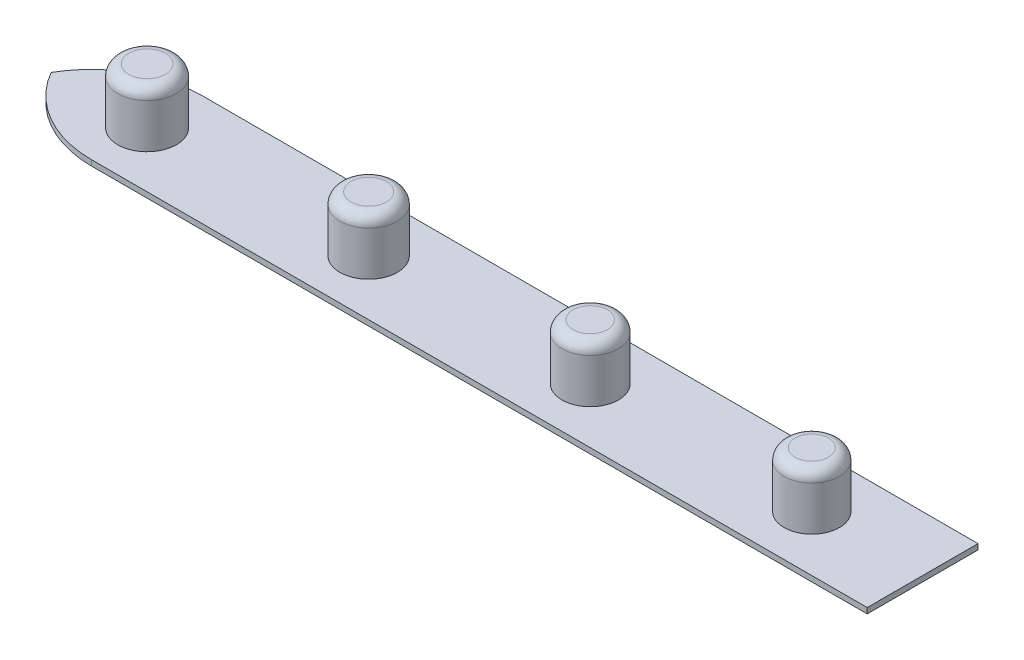
ISO-10303-21;
HEADER;
FILE_DESCRIPTION(('STEP AP214'),'2;1');
FILE_NAME('part.step','',(''),(''),'','','');
FILE_SCHEMA(('AUTOMOTIVE_DESIGN { 1 0 10303 214 1 1 1 1 }'));
ENDSEC;
DATA;
#1=APPLICATION_CONTEXT('core data for automotive mechanical design processes');
#2=APPLICATION_PROTOCOL_DEFINITION('international standard','automotive_design',2000,#1);
#3=PRODUCT_CONTEXT('',#1,'mechanical');
#4=PRODUCT('Part','Part','',(#3));
#5=PRODUCT_RELATED_PRODUCT_CATEGORY('part','',(#4));
#6=PRODUCT_DEFINITION_FORMATION('','',#4);
#7=PRODUCT_DEFINITION_CONTEXT('part definition',#1,'design');
#8=PRODUCT_DEFINITION('design','',#6,#7);
#9=PRODUCT_DEFINITION_SHAPE('','',#8);
#10=(LENGTH_UNIT() NAMED_UNIT(*) SI_UNIT(.MILLI.,.METRE.));
#11=(NAMED_UNIT(*) PLANE_ANGLE_UNIT() SI_UNIT($,.RADIAN.));
#12=(NAMED_UNIT(*) SI_UNIT($,.STERADIAN.) SOLID_ANGLE_UNIT());
#13=UNCERTAINTY_MEASURE_WITH_UNIT(LENGTH_MEASURE(1.E-05),#10,'distance_accuracy_value','');
#14=(GEOMETRIC_REPRESENTATION_CONTEXT(3) GLOBAL_UNCERTAINTY_ASSIGNED_CONTEXT((#13)) GLOBAL_UNIT_ASSIGNED_CONTEXT((#10,
#11,#12)) REPRESENTATION_CONTEXT('',''));
#15=CARTESIAN_POINT('',(0.,0.,0.));
#16=DIRECTION('',(0.,0.,1.));
#17=DIRECTION('',(1.,0.,0.));
#18=AXIS2_PLACEMENT_3D('',#15,#16,#17);
#19=CARTESIAN_POINT('',(40.,0.5,-5.));
#20=DIRECTION('',(-1.,0.,0.));
#21=DIRECTION('',(0.,0.,1.));
#22=AXIS2_PLACEMENT_3D('',#19,#20,#21);
#23=PLANE('',#22);
#24=DIRECTION('',(0.,0.,-1.));
#25=VECTOR('',#24,1.);
#26=CARTESIAN_POINT('',(40.,0.,-5.));
#27=LINE('',#26,#25);
#28=CARTESIAN_POINT('',(40.,0.,5.));
#29=VERTEX_POINT('',#28);
#30=CARTESIAN_POINT('',(40.,0.,-5.));
#31=VERTEX_POINT('',#30);
#32=EDGE_CURVE('E96',#29,#31,#27,.T.);
#33=ORIENTED_EDGE('',*,*,#32,.T.);
#34=DIRECTION('',(0.,-1.,0.));
#35=VECTOR('',#34,1.);
#36=CARTESIAN_POINT('',(40.,0.5,-5.));
#37=LINE('',#36,#35);
#38=CARTESIAN_POINT('',(40.,0.5,-5.));
#39=VERTEX_POINT('',#38);
#40=EDGE_CURVE('E81',#39,#31,#37,.T.);
#41=ORIENTED_EDGE('',*,*,#40,.F.);
#42=DIRECTION('',(0.,0.,-1.));
#43=VECTOR('',#42,1.);
#44=CARTESIAN_POINT('',(40.,0.5,-5.));
#45=LINE('',#44,#43);
#46=CARTESIAN_POINT('',(40.,0.5,5.));
#47=VERTEX_POINT('',#46);
#48=EDGE_CURVE('E86',#47,#39,#45,.T.);
#49=ORIENTED_EDGE('',*,*,#48,.F.);
#50=DIRECTION('',(0.,-1.,0.));
#51=VECTOR('',#50,1.);
#52=CARTESIAN_POINT('',(40.,0.5,5.));
#53=LINE('',#52,#51);
#54=EDGE_CURVE('E98',#47,#29,#53,.T.);
#55=ORIENTED_EDGE('',*,*,#54,.T.);
#56=EDGE_LOOP('',(#33,#41,#49,#55));
#57=FACE_BOUND('',#56,.T.);
#58=ADVANCED_FACE('F32',(#57),#23,.F.);
#59=CARTESIAN_POINT('',(-40.,0.5,-5.));
#60=DIRECTION('',(0.,0.,1.));
#61=DIRECTION('',(1.,0.,0.));
#62=AXIS2_PLACEMENT_3D('',#59,#60,#61);
#63=PLANE('',#62);
#64=DIRECTION('',(-1.,0.,0.));
#65=VECTOR('',#64,1.);
#66=CARTESIAN_POINT('',(-40.,0.,-5.));
#67=LINE('',#66,#65);
#68=CARTESIAN_POINT('',(-29.9999999999999,0.,-5.));
#69=VERTEX_POINT('',#68);
#70=EDGE_CURVE('E135',#31,#69,#67,.T.);
#71=ORIENTED_EDGE('',*,*,#70,.T.);
#72=DIRECTION('',(0.,-1.,0.));
#73=VECTOR('',#72,1.);
#74=CARTESIAN_POINT('',(-29.9999999999999,0.5,-5.));
#75=LINE('',#74,#73);
#76=CARTESIAN_POINT('',(-29.9999999999999,0.5,-5.));
#77=VERTEX_POINT('',#76);
#78=EDGE_CURVE('E84',#69,#77,#75,.F.);
#79=ORIENTED_EDGE('',*,*,#78,.T.);
#80=DIRECTION('',(-1.,0.,0.));
#81=VECTOR('',#80,1.);
#82=CARTESIAN_POINT('',(-40.,0.5,-5.));
#83=LINE('',#82,#81);
#84=EDGE_CURVE('E76',#39,#77,#83,.T.);
#85=ORIENTED_EDGE('',*,*,#84,.F.);
#86=ORIENTED_EDGE('',*,*,#40,.T.);
#87=EDGE_LOOP('',(#71,#79,#85,#86));
#88=FACE_BOUND('',#87,.T.);
#89=ADVANCED_FACE('F79',(#88),#63,.F.);
#90=CARTESIAN_POINT('',(-39.9999999999999,0.5,5.));
#91=DIRECTION('',(0.,0.,-1.));
#92=DIRECTION('',(-1.,0.,0.));
#93=AXIS2_PLACEMENT_3D('',#90,#91,#92);
#94=PLANE('',#93);
#95=DIRECTION('',(1.,0.,0.));
#96=VECTOR('',#95,1.);
#97=CARTESIAN_POINT('',(-39.9999999999999,0.5,5.));
#98=LINE('',#97,#96);
#99=CARTESIAN_POINT('',(-30.,0.5,5.));
#100=VERTEX_POINT('',#99);
#101=EDGE_CURVE('E85',#100,#47,#98,.T.);
#102=ORIENTED_EDGE('',*,*,#101,.F.);
#103=DIRECTION('',(0.,-1.,0.));
#104=VECTOR('',#103,1.);
#105=CARTESIAN_POINT('',(-30.,0.5,5.));
#106=LINE('',#105,#104);
#107=CARTESIAN_POINT('',(-30.,0.,5.));
#108=VERTEX_POINT('',#107);
#109=EDGE_CURVE('E11',#100,#108,#106,.T.);
#110=ORIENTED_EDGE('',*,*,#109,.T.);
#111=DIRECTION('',(1.,0.,0.));
#112=VECTOR('',#111,1.);
#113=CARTESIAN_POINT('',(-39.9999999999999,0.,5.));
#114=LINE('',#113,#112);
#115=EDGE_CURVE('E93',#108,#29,#114,.T.);
#116=ORIENTED_EDGE('',*,*,#115,.T.);
#117=ORIENTED_EDGE('',*,*,#54,.F.);
#118=EDGE_LOOP('',(#102,#110,#116,#117));
#119=FACE_BOUND('',#118,.T.);
#120=ADVANCED_FACE('F161',(#119),#94,.F.);
#121=CARTESIAN_POINT('',(0.,0.5,0.));
#122=DIRECTION('',(0.,1.,0.));
#123=DIRECTION('',(0.,0.,1.));
#124=AXIS2_PLACEMENT_3D('',#121,#122,#123);
#125=PLANE('',#124);
#126=CARTESIAN_POINT('',(30.0000000000001,0.5,0.));
#127=DIRECTION('',(0.,1.,0.));
#128=DIRECTION('',(0.,0.,1.));
#129=AXIS2_PLACEMENT_3D('',#126,#127,#128);
#130=CIRCLE('',#129,2.5);
#131=CARTESIAN_POINT('',(30.0000000000001,0.5,2.5));
#132=VERTEX_POINT('',#131);
#133=EDGE_CURVE('E144',#132,#132,#130,.T.);
#134=ORIENTED_EDGE('',*,*,#133,.F.);
#135=EDGE_LOOP('',(#134));
#136=FACE_BOUND('',#135,.T.);
#137=CARTESIAN_POINT('',(10.0000000000001,0.5,0.));
#138=DIRECTION('',(0.,1.,0.));
#139=DIRECTION('',(0.,0.,1.));
#140=AXIS2_PLACEMENT_3D('',#137,#138,#139);
#141=CIRCLE('',#140,2.55);
#142=CARTESIAN_POINT('',(10.0000000000001,0.5,2.55));
#143=VERTEX_POINT('',#142);
#144=EDGE_CURVE('E146',#143,#143,#141,.T.);
#145=ORIENTED_EDGE('',*,*,#144,.F.);
#146=EDGE_LOOP('',(#145));
#147=FACE_BOUND('',#146,.T.);
#148=CARTESIAN_POINT('',(-9.99999999999994,0.5,0.));
#149=DIRECTION('',(0.,1.,0.));
#150=DIRECTION('',(0.,0.,1.));
#151=AXIS2_PLACEMENT_3D('',#148,#149,#150);
#152=CIRCLE('',#151,2.6);
#153=CARTESIAN_POINT('',(-9.99999999999994,0.5,2.6));
#154=VERTEX_POINT('',#153);
#155=EDGE_CURVE('E151',#154,#154,#152,.T.);
#156=ORIENTED_EDGE('',*,*,#155,.F.);
#157=EDGE_LOOP('',(#156));
#158=FACE_BOUND('',#157,.T.);
#159=CARTESIAN_POINT('',(-29.9999999999999,0.5,0.));
#160=DIRECTION('',(0.,1.,0.));
#161=DIRECTION('',(0.,0.,1.));
#162=AXIS2_PLACEMENT_3D('',#159,#160,#161);
#163=CIRCLE('',#162,2.65);
#164=CARTESIAN_POINT('',(-29.9999999999999,0.5,2.65));
#165=VERTEX_POINT('',#164);
#166=EDGE_CURVE('E156',#165,#165,#163,.T.);
#167=ORIENTED_EDGE('',*,*,#166,.F.);
#168=EDGE_LOOP('',(#167));
#169=FACE_BOUND('',#168,.T.);
#170=ORIENTED_EDGE('',*,*,#84,.T.);
#171=CARTESIAN_POINT('',(-29.9999999999999,0.5,5.));
#172=DIRECTION('',(0.,1.,0.));
#173=DIRECTION('',(0.,0.,1.));
#174=AXIS2_PLACEMENT_3D('',#171,#172,#173);
#175=CIRCLE('',#174,10.);
#176=CARTESIAN_POINT('',(-38.6602540378443,0.5,0.));
#177=VERTEX_POINT('',#176);
#178=EDGE_CURVE('E41',#77,#177,#175,.T.);
#179=ORIENTED_EDGE('',*,*,#178,.T.);
#180=CARTESIAN_POINT('',(-30.,0.5,-5.));
#181=DIRECTION('',(0.,1.,0.));
#182=DIRECTION('',(0.,0.,1.));
#183=AXIS2_PLACEMENT_3D('',#180,#181,#182);
#184=CIRCLE('',#183,10.);
#185=EDGE_CURVE('E51',#177,#100,#184,.T.);
#186=ORIENTED_EDGE('',*,*,#185,.T.);
#187=ORIENTED_EDGE('',*,*,#101,.T.);
#188=ORIENTED_EDGE('',*,*,#48,.T.);
#189=EDGE_LOOP('',(#170,#179,#186,#187,#188));
#190=FACE_BOUND('',#189,.T.);
#191=ADVANCED_FACE('F89',(#136,#147,#158,#169,#190),#125,.T.);
#192=CARTESIAN_POINT('',(0.,0.,0.));
#193=DIRECTION('',(0.,1.,0.));
#194=DIRECTION('',(0.,0.,1.));
#195=AXIS2_PLACEMENT_3D('',#192,#193,#194);
#196=PLANE('',#195);
#197=CARTESIAN_POINT('',(-30.,0.,-5.));
#198=DIRECTION('',(0.,1.,0.));
#199=DIRECTION('',(0.,0.,1.));
#200=AXIS2_PLACEMENT_3D('',#197,#198,#199);
#201=CIRCLE('',#200,10.);
#202=CARTESIAN_POINT('',(-38.6602540378443,0.,0.));
#203=VERTEX_POINT('',#202);
#204=EDGE_CURVE('E126',#108,#203,#201,.F.);
#205=ORIENTED_EDGE('',*,*,#204,.T.);
#206=CARTESIAN_POINT('',(-29.9999999999999,0.,5.));
#207=DIRECTION('',(0.,1.,0.));
#208=DIRECTION('',(0.,0.,1.));
#209=AXIS2_PLACEMENT_3D('',#206,#207,#208);
#210=CIRCLE('',#209,10.);
#211=EDGE_CURVE('E128',#203,#69,#210,.F.);
#212=ORIENTED_EDGE('',*,*,#211,.T.);
#213=ORIENTED_EDGE('',*,*,#70,.F.);
#214=ORIENTED_EDGE('',*,*,#32,.F.);
#215=ORIENTED_EDGE('',*,*,#115,.F.);
#216=EDGE_LOOP('',(#205,#212,#213,#214,#215));
#217=FACE_BOUND('',#216,.T.);
#218=ADVANCED_FACE('F134',(#217),#196,.F.);
#219=CARTESIAN_POINT('',(-29.9999999999999,5.5,0.));
#220=DIRECTION('',(0.,-1.,0.));
#221=DIRECTION('',(0.,0.,-1.));
#222=AXIS2_PLACEMENT_3D('',#219,#220,#221);
#223=CYLINDRICAL_SURFACE('',#222,2.65);
#224=CARTESIAN_POINT('',(-29.9999999999999,4.5,0.));
#225=DIRECTION('',(0.,1.,0.));
#226=DIRECTION('',(0.,0.,1.));
#227=AXIS2_PLACEMENT_3D('',#224,#225,#226);
#228=CIRCLE('',#227,2.65);
#229=CARTESIAN_POINT('',(-29.9999999999999,4.5,2.65));
#230=VERTEX_POINT('',#229);
#231=EDGE_CURVE('E123',#230,#230,#228,.F.);
#232=ORIENTED_EDGE('',*,*,#231,.T.);
#233=EDGE_LOOP('',(#232));
#234=FACE_BOUND('',#233,.T.);
#235=ORIENTED_EDGE('',*,*,#166,.T.);
#236=EDGE_LOOP('',(#235));
#237=FACE_BOUND('',#236,.T.);
#238=ADVANCED_FACE('F216',(#234,#237),#223,.T.);
#239=CARTESIAN_POINT('',(-29.9999999999999,5.5,0.));
#240=DIRECTION('',(0.,1.,0.));
#241=DIRECTION('',(0.,0.,1.));
#242=AXIS2_PLACEMENT_3D('',#239,#240,#241);
#243=PLANE('',#242);
#244=CARTESIAN_POINT('',(-29.9999999999999,5.5,0.));
#245=DIRECTION('',(0.,1.,0.));
#246=DIRECTION('',(0.,0.,1.));
#247=AXIS2_PLACEMENT_3D('',#244,#245,#246);
#248=CIRCLE('',#247,1.65);
#249=CARTESIAN_POINT('',(-29.9999999999999,5.5,1.65));
#250=VERTEX_POINT('',#249);
#251=EDGE_CURVE('E120',#250,#250,#248,.T.);
#252=ORIENTED_EDGE('',*,*,#251,.T.);
#253=EDGE_LOOP('',(#252));
#254=FACE_BOUND('',#253,.T.);
#255=ADVANCED_FACE('F209',(#254),#243,.T.);
#256=CARTESIAN_POINT('',(-9.99999999999994,5.5,0.));
#257=DIRECTION('',(0.,-1.,0.));
#258=DIRECTION('',(0.,0.,-1.));
#259=AXIS2_PLACEMENT_3D('',#256,#257,#258);
#260=CYLINDRICAL_SURFACE('',#259,2.6);
#261=CARTESIAN_POINT('',(-9.99999999999994,4.5,0.));
#262=DIRECTION('',(0.,1.,0.));
#263=DIRECTION('',(0.,0.,1.));
#264=AXIS2_PLACEMENT_3D('',#261,#262,#263);
#265=CIRCLE('',#264,2.6);
#266=CARTESIAN_POINT('',(-9.99999999999994,4.5,2.6));
#267=VERTEX_POINT('',#266);
#268=EDGE_CURVE('E117',#267,#267,#265,.F.);
#269=ORIENTED_EDGE('',*,*,#268,.T.);
#270=EDGE_LOOP('',(#269));
#271=FACE_BOUND('',#270,.T.);
#272=ORIENTED_EDGE('',*,*,#155,.T.);
#273=EDGE_LOOP('',(#272));
#274=FACE_BOUND('',#273,.T.);
#275=ADVANCED_FACE('F200',(#271,#274),#260,.T.);
#276=CARTESIAN_POINT('',(-9.99999999999994,5.5,0.));
#277=DIRECTION('',(0.,1.,0.));
#278=DIRECTION('',(0.,0.,1.));
#279=AXIS2_PLACEMENT_3D('',#276,#277,#278);
#280=PLANE('',#279);
#281=CARTESIAN_POINT('',(-9.99999999999994,5.5,0.));
#282=DIRECTION('',(0.,1.,0.));
#283=DIRECTION('',(0.,0.,1.));
#284=AXIS2_PLACEMENT_3D('',#281,#282,#283);
#285=CIRCLE('',#284,1.6);
#286=CARTESIAN_POINT('',(-9.99999999999994,5.5,1.6));
#287=VERTEX_POINT('',#286);
#288=EDGE_CURVE('E114',#287,#287,#285,.T.);
#289=ORIENTED_EDGE('',*,*,#288,.T.);
#290=EDGE_LOOP('',(#289));
#291=FACE_BOUND('',#290,.T.);
#292=ADVANCED_FACE('F197',(#291),#280,.T.);
#293=CARTESIAN_POINT('',(10.0000000000001,5.5,0.));
#294=DIRECTION('',(0.,-1.,0.));
#295=DIRECTION('',(0.,0.,-1.));
#296=AXIS2_PLACEMENT_3D('',#293,#294,#295);
#297=CYLINDRICAL_SURFACE('',#296,2.55);
#298=CARTESIAN_POINT('',(10.0000000000001,4.5,0.));
#299=DIRECTION('',(0.,1.,0.));
#300=DIRECTION('',(0.,0.,1.));
#301=AXIS2_PLACEMENT_3D('',#298,#299,#300);
#302=CIRCLE('',#301,2.55);
#303=CARTESIAN_POINT('',(10.0000000000001,4.5,2.55));
#304=VERTEX_POINT('',#303);
#305=EDGE_CURVE('E111',#304,#304,#302,.F.);
#306=ORIENTED_EDGE('',*,*,#305,.T.);
#307=EDGE_LOOP('',(#306));
#308=FACE_BOUND('',#307,.T.);
#309=ORIENTED_EDGE('',*,*,#144,.T.);
#310=EDGE_LOOP('',(#309));
#311=FACE_BOUND('',#310,.T.);
#312=ADVANCED_FACE('F199',(#308,#311),#297,.T.);
#313=CARTESIAN_POINT('',(10.0000000000001,5.5,0.));
#314=DIRECTION('',(0.,1.,0.));
#315=DIRECTION('',(0.,0.,1.));
#316=AXIS2_PLACEMENT_3D('',#313,#314,#315);
#317=PLANE('',#316);
#318=CARTESIAN_POINT('',(10.0000000000001,5.5,0.));
#319=DIRECTION('',(0.,1.,0.));
#320=DIRECTION('',(0.,0.,1.));
#321=AXIS2_PLACEMENT_3D('',#318,#319,#320);
#322=CIRCLE('',#321,1.55);
#323=CARTESIAN_POINT('',(10.0000000000001,5.5,1.55));
#324=VERTEX_POINT('',#323);
#325=EDGE_CURVE('E108',#324,#324,#322,.T.);
#326=ORIENTED_EDGE('',*,*,#325,.T.);
#327=EDGE_LOOP('',(#326));
#328=FACE_BOUND('',#327,.T.);
#329=ADVANCED_FACE('F206',(#328),#317,.T.);
#330=CARTESIAN_POINT('',(30.0000000000001,5.5,0.));
#331=DIRECTION('',(0.,-1.,0.));
#332=DIRECTION('',(0.,0.,-1.));
#333=AXIS2_PLACEMENT_3D('',#330,#331,#332);
#334=CYLINDRICAL_SURFACE('',#333,2.5);
#335=CARTESIAN_POINT('',(30.0000000000001,4.5,0.));
#336=DIRECTION('',(0.,1.,0.));
#337=DIRECTION('',(0.,0.,1.));
#338=AXIS2_PLACEMENT_3D('',#335,#336,#337);
#339=CIRCLE('',#338,2.5);
#340=CARTESIAN_POINT('',(30.0000000000001,4.5,2.5));
#341=VERTEX_POINT('',#340);
#342=EDGE_CURVE('E101',#341,#341,#339,.F.);
#343=ORIENTED_EDGE('',*,*,#342,.T.);
#344=EDGE_LOOP('',(#343));
#345=FACE_BOUND('',#344,.T.);
#346=ORIENTED_EDGE('',*,*,#133,.T.);
#347=EDGE_LOOP('',(#346));
#348=FACE_BOUND('',#347,.T.);
#349=ADVANCED_FACE('F269',(#345,#348),#334,.T.);
#350=CARTESIAN_POINT('',(30.0000000000001,5.5,0.));
#351=DIRECTION('',(0.,1.,0.));
#352=DIRECTION('',(0.,0.,1.));
#353=AXIS2_PLACEMENT_3D('',#350,#351,#352);
#354=PLANE('',#353);
#355=CARTESIAN_POINT('',(30.0000000000001,5.5,0.));
#356=DIRECTION('',(0.,1.,0.));
#357=DIRECTION('',(0.,0.,1.));
#358=AXIS2_PLACEMENT_3D('',#355,#356,#357);
#359=CIRCLE('',#358,1.5);
#360=CARTESIAN_POINT('',(30.0000000000001,5.5,1.5));
#361=VERTEX_POINT('',#360);
#362=EDGE_CURVE('E97',#361,#361,#359,.T.);
#363=ORIENTED_EDGE('',*,*,#362,.T.);
#364=EDGE_LOOP('',(#363));
#365=FACE_BOUND('',#364,.T.);
#366=ADVANCED_FACE('F184',(#365),#354,.T.);
#367=CARTESIAN_POINT('',(30.0000000000001,4.5,0.));
#368=DIRECTION('',(0.,1.,0.));
#369=DIRECTION('',(0.,0.,1.));
#370=AXIS2_PLACEMENT_3D('',#367,#368,#369);
#371=TOROIDAL_SURFACE('',#370,1.5,1.);
#372=ORIENTED_EDGE('',*,*,#342,.F.);
#373=EDGE_LOOP('',(#372));
#374=FACE_BOUND('',#373,.T.);
#375=ORIENTED_EDGE('',*,*,#362,.F.);
#376=EDGE_LOOP('',(#375));
#377=FACE_BOUND('',#376,.T.);
#378=ADVANCED_FACE('F180',(#374,#377),#371,.T.);
#379=CARTESIAN_POINT('',(10.0000000000001,4.5,0.));
#380=DIRECTION('',(0.,1.,0.));
#381=DIRECTION('',(0.,0.,1.));
#382=AXIS2_PLACEMENT_3D('',#379,#380,#381);
#383=TOROIDAL_SURFACE('',#382,1.55,1.);
#384=ORIENTED_EDGE('',*,*,#305,.F.);
#385=EDGE_LOOP('',(#384));
#386=FACE_BOUND('',#385,.T.);
#387=ORIENTED_EDGE('',*,*,#325,.F.);
#388=EDGE_LOOP('',(#387));
#389=FACE_BOUND('',#388,.T.);
#390=ADVANCED_FACE('F183',(#386,#389),#383,.T.);
#391=CARTESIAN_POINT('',(-9.99999999999994,4.5,0.));
#392=DIRECTION('',(0.,1.,0.));
#393=DIRECTION('',(0.,0.,1.));
#394=AXIS2_PLACEMENT_3D('',#391,#392,#393);
#395=TOROIDAL_SURFACE('',#394,1.6,1.);
#396=ORIENTED_EDGE('',*,*,#268,.F.);
#397=EDGE_LOOP('',(#396));
#398=FACE_BOUND('',#397,.T.);
#399=ORIENTED_EDGE('',*,*,#288,.F.);
#400=EDGE_LOOP('',(#399));
#401=FACE_BOUND('',#400,.T.);
#402=ADVANCED_FACE('F169',(#398,#401),#395,.T.);
#403=CARTESIAN_POINT('',(-29.9999999999999,4.5,0.));
#404=DIRECTION('',(0.,1.,0.));
#405=DIRECTION('',(0.,0.,1.));
#406=AXIS2_PLACEMENT_3D('',#403,#404,#405);
#407=TOROIDAL_SURFACE('',#406,1.65,1.);
#408=ORIENTED_EDGE('',*,*,#231,.F.);
#409=EDGE_LOOP('',(#408));
#410=FACE_BOUND('',#409,.T.);
#411=ORIENTED_EDGE('',*,*,#251,.F.);
#412=EDGE_LOOP('',(#411));
#413=FACE_BOUND('',#412,.T.);
#414=ADVANCED_FACE('F164',(#410,#413),#407,.T.);
#415=CARTESIAN_POINT('',(-30.,0.5,-5.));
#416=DIRECTION('',(0.,-1.,0.));
#417=DIRECTION('',(0.,0.,-1.));
#418=AXIS2_PLACEMENT_3D('',#415,#416,#417);
#419=CYLINDRICAL_SURFACE('',#418,10.);
#420=ORIENTED_EDGE('',*,*,#109,.F.);
#421=ORIENTED_EDGE('',*,*,#185,.F.);
#422=DIRECTION('',(0.,-1.,0.));
#423=VECTOR('',#422,1.);
#424=CARTESIAN_POINT('',(-38.6602540378443,0.25,0.));
#425=LINE('',#424,#423);
#426=EDGE_CURVE('E36',#203,#177,#425,.F.);
#427=ORIENTED_EDGE('',*,*,#426,.F.);
#428=ORIENTED_EDGE('',*,*,#204,.F.);
#429=EDGE_LOOP('',(#420,#421,#427,#428));
#430=FACE_BOUND('',#429,.T.);
#431=ADVANCED_FACE('F34',(#430),#419,.T.);
#432=CARTESIAN_POINT('',(-29.9999999999999,0.5,5.));
#433=DIRECTION('',(0.,-1.,0.));
#434=DIRECTION('',(0.,0.,-1.));
#435=AXIS2_PLACEMENT_3D('',#432,#433,#434);
#436=CYLINDRICAL_SURFACE('',#435,10.);
#437=ORIENTED_EDGE('',*,*,#178,.F.);
#438=ORIENTED_EDGE('',*,*,#78,.F.);
#439=ORIENTED_EDGE('',*,*,#211,.F.);
#440=ORIENTED_EDGE('',*,*,#426,.T.);
#441=EDGE_LOOP('',(#437,#438,#439,#440));
#442=FACE_BOUND('',#441,.T.);
#443=ADVANCED_FACE('F142',(#442),#436,.T.);
#444=CLOSED_SHELL('',(#58,#89,#120,#191,#218,#238,#255,#275,#292,#312,#329,#349,#366,#378,#390,
#402,#414,#431,#443));
#445=MANIFOLD_SOLID_BREP('B2',#444);
#446=ADVANCED_BREP_SHAPE_REPRESENTATION('',(#18,#445),#14);
#447=SHAPE_DEFINITION_REPRESENTATION(#9,#446);
ENDSEC;
END-ISO-10303-21;
